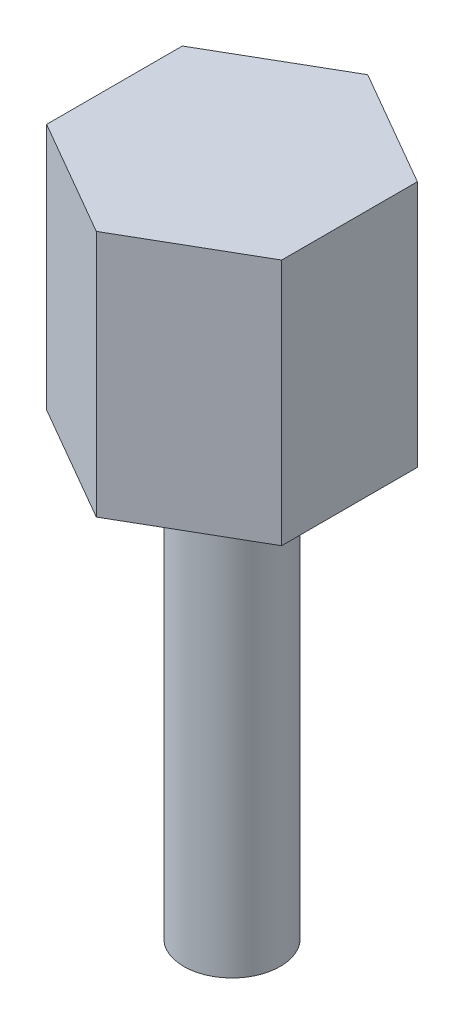
ISO-10303-21;
HEADER;
FILE_DESCRIPTION(('STEP AP214'),'2;1');
FILE_NAME('part.step','',(''),(''),'','','');
FILE_SCHEMA(('AUTOMOTIVE_DESIGN { 1 0 10303 214 1 1 1 1 }'));
ENDSEC;
DATA;
#1=APPLICATION_CONTEXT('core data for automotive mechanical design processes');
#2=APPLICATION_PROTOCOL_DEFINITION('international standard','automotive_design',2000,#1);
#3=PRODUCT_CONTEXT('',#1,'mechanical');
#4=PRODUCT('Part','Part','',(#3));
#5=PRODUCT_RELATED_PRODUCT_CATEGORY('part','',(#4));
#6=PRODUCT_DEFINITION_FORMATION('','',#4);
#7=PRODUCT_DEFINITION_CONTEXT('part definition',#1,'design');
#8=PRODUCT_DEFINITION('design','',#6,#7);
#9=PRODUCT_DEFINITION_SHAPE('','',#8);
#10=(LENGTH_UNIT() NAMED_UNIT(*) SI_UNIT(.MILLI.,.METRE.));
#11=(NAMED_UNIT(*) PLANE_ANGLE_UNIT() SI_UNIT($,.RADIAN.));
#12=(NAMED_UNIT(*) SI_UNIT($,.STERADIAN.) SOLID_ANGLE_UNIT());
#13=UNCERTAINTY_MEASURE_WITH_UNIT(LENGTH_MEASURE(1.E-05),#10,'distance_accuracy_value','');
#14=(GEOMETRIC_REPRESENTATION_CONTEXT(3) GLOBAL_UNCERTAINTY_ASSIGNED_CONTEXT((#13)) GLOBAL_UNIT_ASSIGNED_CONTEXT((#10,
#11,#12)) REPRESENTATION_CONTEXT('',''));
#15=CARTESIAN_POINT('',(0.,0.,0.));
#16=DIRECTION('',(0.,0.,1.));
#17=DIRECTION('',(1.,0.,0.));
#18=AXIS2_PLACEMENT_3D('',#15,#16,#17);
#19=CARTESIAN_POINT('',(0.,7.,0.));
#20=DIRECTION('',(0.,-1.,0.));
#21=DIRECTION('',(0.,0.,-1.));
#22=AXIS2_PLACEMENT_3D('',#19,#20,#21);
#23=CYLINDRICAL_SURFACE('',#22,0.78);
#24=CARTESIAN_POINT('',(0.,7.,0.));
#25=DIRECTION('',(0.,1.,0.));
#26=DIRECTION('',(0.,0.,1.));
#27=AXIS2_PLACEMENT_3D('',#24,#25,#26);
#28=CIRCLE('',#27,0.78);
#29=CARTESIAN_POINT('',(0.,7.,0.78));
#30=VERTEX_POINT('',#29);
#31=EDGE_CURVE('E11',#30,#30,#28,.T.);
#32=ORIENTED_EDGE('',*,*,#31,.F.);
#33=EDGE_LOOP('',(#32));
#34=FACE_BOUND('',#33,.T.);
#35=CARTESIAN_POINT('',(0.,0.,0.));
#36=DIRECTION('',(0.,1.,0.));
#37=DIRECTION('',(0.,0.,1.));
#38=AXIS2_PLACEMENT_3D('',#35,#36,#37);
#39=CIRCLE('',#38,0.78);
#40=CARTESIAN_POINT('',(0.,0.,0.78));
#41=VERTEX_POINT('',#40);
#42=EDGE_CURVE('E42',#41,#41,#39,.T.);
#43=ORIENTED_EDGE('',*,*,#42,.T.);
#44=EDGE_LOOP('',(#43));
#45=FACE_BOUND('',#44,.T.);
#46=ADVANCED_FACE('F39',(#34,#45),#23,.T.);
#47=CARTESIAN_POINT('',(0.,0.,0.));
#48=DIRECTION('',(0.,1.,0.));
#49=DIRECTION('',(0.,0.,1.));
#50=AXIS2_PLACEMENT_3D('',#47,#48,#49);
#51=PLANE('',#50);
#52=ORIENTED_EDGE('',*,*,#42,.F.);
#53=EDGE_LOOP('',(#52));
#54=FACE_BOUND('',#53,.T.);
#55=ADVANCED_FACE('F147',(#54),#51,.F.);
#56=CARTESIAN_POINT('',(1.9,11.,1.09696551146029));
#57=DIRECTION('',(-1.,0.,0.));
#58=DIRECTION('',(0.,0.,1.));
#59=AXIS2_PLACEMENT_3D('',#56,#57,#58);
#60=PLANE('',#59);
#61=DIRECTION('',(0.,0.,-1.));
#62=VECTOR('',#61,1.);
#63=CARTESIAN_POINT('',(1.9,7.,1.09696551146029));
#64=LINE('',#63,#62);
#65=CARTESIAN_POINT('',(1.9,7.,1.09696551146029));
#66=VERTEX_POINT('',#65);
#67=CARTESIAN_POINT('',(1.9,7.,-1.09696551146029));
#68=VERTEX_POINT('',#67);
#69=EDGE_CURVE('E124',#66,#68,#64,.T.);
#70=ORIENTED_EDGE('',*,*,#69,.T.);
#71=DIRECTION('',(0.,-1.,0.));
#72=VECTOR('',#71,1.);
#73=CARTESIAN_POINT('',(1.9,11.,-1.09696551146029));
#74=LINE('',#73,#72);
#75=CARTESIAN_POINT('',(1.9,11.,-1.09696551146029));
#76=VERTEX_POINT('',#75);
#77=EDGE_CURVE('E141',#76,#68,#74,.T.);
#78=ORIENTED_EDGE('',*,*,#77,.F.);
#79=DIRECTION('',(0.,0.,-1.));
#80=VECTOR('',#79,1.);
#81=CARTESIAN_POINT('',(1.9,11.,1.09696551146029));
#82=LINE('',#81,#80);
#83=CARTESIAN_POINT('',(1.9,11.,1.09696551146029));
#84=VERTEX_POINT('',#83);
#85=EDGE_CURVE('E134',#84,#76,#82,.T.);
#86=ORIENTED_EDGE('',*,*,#85,.F.);
#87=DIRECTION('',(0.,-1.,0.));
#88=VECTOR('',#87,1.);
#89=CARTESIAN_POINT('',(1.9,11.,1.09696551146029));
#90=LINE('',#89,#88);
#91=EDGE_CURVE('E120',#84,#66,#90,.T.);
#92=ORIENTED_EDGE('',*,*,#91,.T.);
#93=EDGE_LOOP('',(#70,#78,#86,#92));
#94=FACE_BOUND('',#93,.T.);
#95=ADVANCED_FACE('F149',(#94),#60,.F.);
#96=CARTESIAN_POINT('',(1.9,11.,-1.09696551146029));
#97=DIRECTION('',(-0.5,0.,0.866025403784439));
#98=DIRECTION('',(0.866025403784439,0.,0.5));
#99=AXIS2_PLACEMENT_3D('',#96,#97,#98);
#100=PLANE('',#99);
#101=DIRECTION('',(-0.866025403784439,0.,-0.5));
#102=VECTOR('',#101,1.);
#103=CARTESIAN_POINT('',(1.9,7.,-1.09696551146029));
#104=LINE('',#103,#102);
#105=CARTESIAN_POINT('',(0.,7.,-2.19393102292058));
#106=VERTEX_POINT('',#105);
#107=EDGE_CURVE('E127',#68,#106,#104,.T.);
#108=ORIENTED_EDGE('',*,*,#107,.T.);
#109=DIRECTION('',(0.,-1.,0.));
#110=VECTOR('',#109,1.);
#111=CARTESIAN_POINT('',(0.,11.,-2.19393102292058));
#112=LINE('',#111,#110);
#113=CARTESIAN_POINT('',(0.,11.,-2.19393102292058));
#114=VERTEX_POINT('',#113);
#115=EDGE_CURVE('E138',#114,#106,#112,.T.);
#116=ORIENTED_EDGE('',*,*,#115,.F.);
#117=DIRECTION('',(-0.866025403784439,0.,-0.5));
#118=VECTOR('',#117,1.);
#119=CARTESIAN_POINT('',(1.9,11.,-1.09696551146029));
#120=LINE('',#119,#118);
#121=EDGE_CURVE('E93',#76,#114,#120,.T.);
#122=ORIENTED_EDGE('',*,*,#121,.F.);
#123=ORIENTED_EDGE('',*,*,#77,.T.);
#124=EDGE_LOOP('',(#108,#116,#122,#123));
#125=FACE_BOUND('',#124,.T.);
#126=ADVANCED_FACE('F154',(#125),#100,.F.);
#127=CARTESIAN_POINT('',(0.,11.,-2.19393102292058));
#128=DIRECTION('',(0.5,0.,0.866025403784439));
#129=DIRECTION('',(0.866025403784439,0.,-0.5));
#130=AXIS2_PLACEMENT_3D('',#127,#128,#129);
#131=PLANE('',#130);
#132=DIRECTION('',(-0.866025403784439,0.,0.5));
#133=VECTOR('',#132,1.);
#134=CARTESIAN_POINT('',(0.,7.,-2.19393102292058));
#135=LINE('',#134,#133);
#136=CARTESIAN_POINT('',(-1.9,7.,-1.09696551146029));
#137=VERTEX_POINT('',#136);
#138=EDGE_CURVE('E129',#106,#137,#135,.T.);
#139=ORIENTED_EDGE('',*,*,#138,.T.);
#140=DIRECTION('',(0.,-1.,0.));
#141=VECTOR('',#140,1.);
#142=CARTESIAN_POINT('',(-1.9,11.,-1.09696551146029));
#143=LINE('',#142,#141);
#144=CARTESIAN_POINT('',(-1.9,11.,-1.09696551146029));
#145=VERTEX_POINT('',#144);
#146=EDGE_CURVE('E115',#145,#137,#143,.T.);
#147=ORIENTED_EDGE('',*,*,#146,.F.);
#148=DIRECTION('',(-0.866025403784439,0.,0.5));
#149=VECTOR('',#148,1.);
#150=CARTESIAN_POINT('',(0.,11.,-2.19393102292058));
#151=LINE('',#150,#149);
#152=EDGE_CURVE('E106',#114,#145,#151,.T.);
#153=ORIENTED_EDGE('',*,*,#152,.F.);
#154=ORIENTED_EDGE('',*,*,#115,.T.);
#155=EDGE_LOOP('',(#139,#147,#153,#154));
#156=FACE_BOUND('',#155,.T.);
#157=ADVANCED_FACE('F161',(#156),#131,.F.);
#158=CARTESIAN_POINT('',(-1.9,11.,-1.09696551146029));
#159=DIRECTION('',(1.,0.,0.));
#160=DIRECTION('',(0.,0.,-1.));
#161=AXIS2_PLACEMENT_3D('',#158,#159,#160);
#162=PLANE('',#161);
#163=DIRECTION('',(0.,0.,1.));
#164=VECTOR('',#163,1.);
#165=CARTESIAN_POINT('',(-1.9,7.,-1.09696551146029));
#166=LINE('',#165,#164);
#167=CARTESIAN_POINT('',(-1.9,7.,1.09696551146029));
#168=VERTEX_POINT('',#167);
#169=EDGE_CURVE('E114',#137,#168,#166,.T.);
#170=ORIENTED_EDGE('',*,*,#169,.T.);
#171=DIRECTION('',(0.,-1.,0.));
#172=VECTOR('',#171,1.);
#173=CARTESIAN_POINT('',(-1.9,11.,1.09696551146029));
#174=LINE('',#173,#172);
#175=CARTESIAN_POINT('',(-1.9,11.,1.09696551146029));
#176=VERTEX_POINT('',#175);
#177=EDGE_CURVE('E111',#176,#168,#174,.T.);
#178=ORIENTED_EDGE('',*,*,#177,.F.);
#179=DIRECTION('',(0.,0.,1.));
#180=VECTOR('',#179,1.);
#181=CARTESIAN_POINT('',(-1.9,11.,-1.09696551146029));
#182=LINE('',#181,#180);
#183=EDGE_CURVE('E100',#145,#176,#182,.T.);
#184=ORIENTED_EDGE('',*,*,#183,.F.);
#185=ORIENTED_EDGE('',*,*,#146,.T.);
#186=EDGE_LOOP('',(#170,#178,#184,#185));
#187=FACE_BOUND('',#186,.T.);
#188=ADVANCED_FACE('F112',(#187),#162,.F.);
#189=CARTESIAN_POINT('',(-1.9,11.,1.09696551146029));
#190=DIRECTION('',(0.5,0.,-0.866025403784439));
#191=DIRECTION('',(-0.866025403784439,0.,-0.5));
#192=AXIS2_PLACEMENT_3D('',#189,#190,#191);
#193=PLANE('',#192);
#194=DIRECTION('',(0.866025403784439,0.,0.5));
#195=VECTOR('',#194,1.);
#196=CARTESIAN_POINT('',(-1.9,7.,1.09696551146029));
#197=LINE('',#196,#195);
#198=CARTESIAN_POINT('',(0.,7.,2.19393102292058));
#199=VERTEX_POINT('',#198);
#200=EDGE_CURVE('E78',#168,#199,#197,.T.);
#201=ORIENTED_EDGE('',*,*,#200,.T.);
#202=DIRECTION('',(0.,-1.,0.));
#203=VECTOR('',#202,1.);
#204=CARTESIAN_POINT('',(0.,11.,2.19393102292058));
#205=LINE('',#204,#203);
#206=CARTESIAN_POINT('',(0.,11.,2.19393102292058));
#207=VERTEX_POINT('',#206);
#208=EDGE_CURVE('E116',#207,#199,#205,.T.);
#209=ORIENTED_EDGE('',*,*,#208,.F.);
#210=DIRECTION('',(0.866025403784439,0.,0.5));
#211=VECTOR('',#210,1.);
#212=CARTESIAN_POINT('',(-1.9,11.,1.09696551146029));
#213=LINE('',#212,#211);
#214=EDGE_CURVE('E104',#176,#207,#213,.T.);
#215=ORIENTED_EDGE('',*,*,#214,.F.);
#216=ORIENTED_EDGE('',*,*,#177,.T.);
#217=EDGE_LOOP('',(#201,#209,#215,#216));
#218=FACE_BOUND('',#217,.T.);
#219=ADVANCED_FACE('F118',(#218),#193,.F.);
#220=CARTESIAN_POINT('',(0.,11.,2.19393102292058));
#221=DIRECTION('',(-0.5,0.,-0.866025403784439));
#222=DIRECTION('',(-0.866025403784439,0.,0.5));
#223=AXIS2_PLACEMENT_3D('',#220,#221,#222);
#224=PLANE('',#223);
#225=DIRECTION('',(0.866025403784439,0.,-0.5));
#226=VECTOR('',#225,1.);
#227=CARTESIAN_POINT('',(0.,7.,2.19393102292058));
#228=LINE('',#227,#226);
#229=EDGE_CURVE('E84',#199,#66,#228,.T.);
#230=ORIENTED_EDGE('',*,*,#229,.T.);
#231=ORIENTED_EDGE('',*,*,#91,.F.);
#232=DIRECTION('',(0.866025403784439,0.,-0.5));
#233=VECTOR('',#232,1.);
#234=CARTESIAN_POINT('',(0.,11.,2.19393102292058));
#235=LINE('',#234,#233);
#236=EDGE_CURVE('E55',#207,#84,#235,.T.);
#237=ORIENTED_EDGE('',*,*,#236,.F.);
#238=ORIENTED_EDGE('',*,*,#208,.T.);
#239=EDGE_LOOP('',(#230,#231,#237,#238));
#240=FACE_BOUND('',#239,.T.);
#241=ADVANCED_FACE('F169',(#240),#224,.F.);
#242=CARTESIAN_POINT('',(0.,11.,0.));
#243=DIRECTION('',(0.,1.,0.));
#244=DIRECTION('',(0.,0.,1.));
#245=AXIS2_PLACEMENT_3D('',#242,#243,#244);
#246=PLANE('',#245);
#247=ORIENTED_EDGE('',*,*,#85,.T.);
#248=ORIENTED_EDGE('',*,*,#121,.T.);
#249=ORIENTED_EDGE('',*,*,#152,.T.);
#250=ORIENTED_EDGE('',*,*,#183,.T.);
#251=ORIENTED_EDGE('',*,*,#214,.T.);
#252=ORIENTED_EDGE('',*,*,#236,.T.);
#253=EDGE_LOOP('',(#247,#248,#249,#250,#251,#252));
#254=FACE_BOUND('',#253,.T.);
#255=ADVANCED_FACE('F102',(#254),#246,.T.);
#256=CARTESIAN_POINT('',(0.,7.,0.));
#257=DIRECTION('',(0.,1.,0.));
#258=DIRECTION('',(0.,0.,1.));
#259=AXIS2_PLACEMENT_3D('',#256,#257,#258);
#260=PLANE('',#259);
#261=ORIENTED_EDGE('',*,*,#31,.T.);
#262=EDGE_LOOP('',(#261));
#263=FACE_BOUND('',#262,.T.);
#264=ORIENTED_EDGE('',*,*,#69,.F.);
#265=ORIENTED_EDGE('',*,*,#229,.F.);
#266=ORIENTED_EDGE('',*,*,#200,.F.);
#267=ORIENTED_EDGE('',*,*,#169,.F.);
#268=ORIENTED_EDGE('',*,*,#138,.F.);
#269=ORIENTED_EDGE('',*,*,#107,.F.);
#270=EDGE_LOOP('',(#264,#265,#266,#267,#268,#269));
#271=FACE_BOUND('',#270,.T.);
#272=ADVANCED_FACE('F172',(#263,#271),#260,.F.);
#273=CLOSED_SHELL('',(#46,#55,#95,#126,#157,#188,#219,#241,#255,#272));
#274=MANIFOLD_SOLID_BREP('B2',#273);
#275=ADVANCED_BREP_SHAPE_REPRESENTATION('',(#18,#274),#14);
#276=SHAPE_DEFINITION_REPRESENTATION(#9,#275);
ENDSEC;
END-ISO-10303-21;
